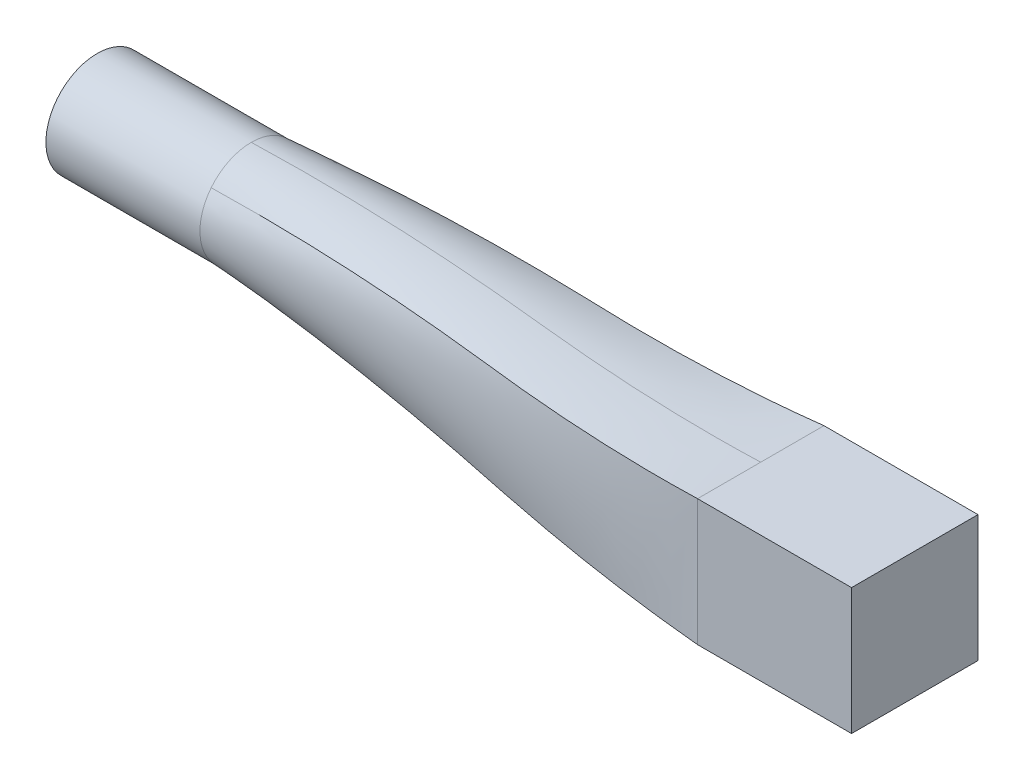
ISO-10303-21;
HEADER;
FILE_DESCRIPTION(('STEP AP214'),'2;1');
FILE_NAME('part.step','',(''),(''),'','','');
FILE_SCHEMA(('AUTOMOTIVE_DESIGN { 1 0 10303 214 1 1 1 1 }'));
ENDSEC;
DATA;
#1=APPLICATION_CONTEXT('core data for automotive mechanical design processes');
#2=APPLICATION_PROTOCOL_DEFINITION('international standard','automotive_design',2000,#1);
#3=PRODUCT_CONTEXT('',#1,'mechanical');
#4=PRODUCT('Part','Part','',(#3));
#5=PRODUCT_RELATED_PRODUCT_CATEGORY('part','',(#4));
#6=PRODUCT_DEFINITION_FORMATION('','',#4);
#7=PRODUCT_DEFINITION_CONTEXT('part definition',#1,'design');
#8=PRODUCT_DEFINITION('design','',#6,#7);
#9=PRODUCT_DEFINITION_SHAPE('','',#8);
#10=(LENGTH_UNIT() NAMED_UNIT(*) SI_UNIT(.MILLI.,.METRE.));
#11=(NAMED_UNIT(*) PLANE_ANGLE_UNIT() SI_UNIT($,.RADIAN.));
#12=(NAMED_UNIT(*) SI_UNIT($,.STERADIAN.) SOLID_ANGLE_UNIT());
#13=UNCERTAINTY_MEASURE_WITH_UNIT(LENGTH_MEASURE(1.E-05),#10,'distance_accuracy_value','');
#14=(GEOMETRIC_REPRESENTATION_CONTEXT(3) GLOBAL_UNCERTAINTY_ASSIGNED_CONTEXT((#13)) GLOBAL_UNIT_ASSIGNED_CONTEXT((#10,
#11,#12)) REPRESENTATION_CONTEXT('',''));
#15=CARTESIAN_POINT('',(0.,0.,0.));
#16=DIRECTION('',(0.,0.,1.));
#17=DIRECTION('',(1.,0.,0.));
#18=AXIS2_PLACEMENT_3D('',#15,#16,#17);
#19=CARTESIAN_POINT('',(0.,63.7863619156872,-79.7329523946089));
#20=CARTESIAN_POINT('',(193.877836208573,77.1217264968186,-88.5158134764794));
#21=CARTESIAN_POINT('',(387.852255577892,75.7807951885969,-97.2986745583499));
#22=CARTESIAN_POINT('',(724.025214907135,47.9362334339431,-112.631023760147));
#23=CARTESIAN_POINT('',(868.712821410133,47.2684985361766,-119.180511880073));
#24=CARTESIAN_POINT('',(1013.26771114708,57.8788888677979,-125.73));
#25=CARTESIAN_POINT('',(0.,69.4779385507464,-75.1796910865616));
#26=CARTESIAN_POINT('',(193.877836208573,81.7265306209246,-82.7308405347025));
#27=CARTESIAN_POINT('',(387.852255577892,79.2988268017497,-90.2819899828435));
#28=CARTESIAN_POINT('',(724.025214907135,49.5570728354095,-103.464124953968));
#29=CARTESIAN_POINT('',(868.712821410133,48.0789182369098,-109.095110476952));
#30=CARTESIAN_POINT('',(1013.26771114708,57.8788888677979,-114.726095999935));
#31=CARTESIAN_POINT('',(0.,80.1263231421359,-64.6489366794776));
#32=CARTESIAN_POINT('',(193.877836208573,90.3416698741602,-70.117757743955));
#33=CARTESIAN_POINT('',(387.852255577892,85.8807207168314,-75.5865788084324));
#34=CARTESIAN_POINT('',(724.025214907135,52.5895052200281,-85.1335673695738));
#35=CARTESIAN_POINT('',(868.712821410133,49.5951344292191,-89.2117348662377));
#36=CARTESIAN_POINT('',(1013.26771114708,57.8788888677979,-93.2899023629016));
#37=CARTESIAN_POINT('',(0.,90.4960369406616,-48.3933185319076));
#38=CARTESIAN_POINT('',(193.877836208573,98.7313488553962,-51.9974731378035));
#39=CARTESIAN_POINT('',(387.852255577892,92.2903648807777,-55.6016277436994));
#40=CARTESIAN_POINT('',(724.025214907135,55.5425781177991,-61.893445009138));
#41=CARTESIAN_POINT('',(868.712821410133,51.0716708781046,-64.5811076686806));
#42=CARTESIAN_POINT('',(1013.26771114708,57.8788888677979,-67.2687703282233));
#43=CARTESIAN_POINT('',(0.,96.4786554645607,-34.098932619656));
#44=CARTESIAN_POINT('',(193.877836208573,103.571622160706,-36.4906606033748));
#45=CARTESIAN_POINT('',(387.852255577892,95.9882929674987,-38.8823885870935));
#46=CARTESIAN_POINT('',(724.025214907135,57.2463000298871,-43.0576577050101));
#47=CARTESIAN_POINT('',(868.712821410133,51.9235318341486,-44.841198839208));
#48=CARTESIAN_POINT('',(1013.26771114708,57.8788888677979,-46.6247399734059));
#49=CARTESIAN_POINT('',(0.,99.7287540430286,-22.9225454122928));
#50=CARTESIAN_POINT('',(193.877836208573,106.201133857991,-24.4958663298067));
#51=CARTESIAN_POINT('',(387.852255577892,97.9972177836001,-26.0691872473206));
#52=CARTESIAN_POINT('',(724.025214907135,58.1718586531658,-28.815753029126));
#53=CARTESIAN_POINT('',(868.712821410133,52.3863111457879,-29.9889978934174));
#54=CARTESIAN_POINT('',(1013.26771114708,57.8788888677979,-31.1622427577088));
#55=CARTESIAN_POINT('',(0.,101.679670600911,-11.4807903492074));
#56=CARTESIAN_POINT('',(193.877836208573,107.7795345697,-12.2777083176404));
#57=CARTESIAN_POINT('',(387.852255577892,99.2031026491359,-13.0746262860734));
#58=CARTESIAN_POINT('',(724.025214907135,58.7274379994073,-14.4658158384646));
#59=CARTESIAN_POINT('',(868.712821410133,52.6641008189087,-15.0600874224228));
#60=CARTESIAN_POINT('',(1013.26771114708,57.8788888677979,-15.6543590063811));
#61=CARTESIAN_POINT('',(0.,102.108,-3.81226759974524));
#62=CARTESIAN_POINT('',(193.877836208573,108.126077032337,-4.08464588073089));
#63=CARTESIAN_POINT('',(387.852255577892,99.4678581753207,-4.35702416171652));
#64=CARTESIAN_POINT('',(724.025214907135,58.8494170592293,-4.83251829513478));
#65=CARTESIAN_POINT('',(868.712821410133,52.7250903488197,-5.0356341475674));
#66=CARTESIAN_POINT('',(1013.26771114708,57.8788888677979,-5.23875000000002));
#67=CARTESIAN_POINT('',(0.,102.108,0.));
#68=CARTESIAN_POINT('',(193.877836208573,108.126077032337,0.));
#69=CARTESIAN_POINT('',(387.852255577892,99.4678581753207,0.));
#70=CARTESIAN_POINT('',(724.025214907135,58.8494170592293,0.));
#71=CARTESIAN_POINT('',(868.712821410133,52.7250903488197,0.));
#72=CARTESIAN_POINT('',(1013.26771114708,57.8788888677979,0.));
#73=B_SPLINE_SURFACE_WITH_KNOTS('',3,3,((#19,#20,#21,#22,#23,#24),(#25,#26,#27,#28,#29,#30),
(#31,#32,#33,#34,#35,#36),(#37,#38,#39,#40,#41,#42),(#43,#44,#45,#46,#47,#48),(#49,#50,#51,#52,
#53,#54),(#55,#56,#57,#58,#59,#60),(#61,#62,#63,#64,#65,#66),(#67,#68,#69,#70,#71,#72)),
.UNSPECIFIED.,.F.,.F.,.F.,(4,1,1,1,1,1,4),(4,2,4),(0.866194178130681,0.899645633598011,
0.93309708906534,0.949822816799005,0.96654854453267,0.983274272266335,1.),(0.,0.572832053736493,
1.),.UNSPECIFIED.);
#74=CARTESIAN_POINT('',(0.,0.,0.));
#75=DIRECTION('',(1.,0.,0.));
#76=DIRECTION('',(0.,0.,-1.));
#77=AXIS2_PLACEMENT_3D('',#74,#75,#76);
#78=CIRCLE('',#77,102.108);
#79=CARTESIAN_POINT('',(0.,63.7867207358618,-79.7334010755966));
#80=VERTEX_POINT('',#79);
#81=CARTESIAN_POINT('',(0.,102.108,0.));
#82=VERTEX_POINT('',#81);
#83=EDGE_CURVE('E297',#80,#82,#78,.T.);
#84=CARTESIAN_POINT('',(0.,102.108,0.));
#85=CARTESIAN_POINT('',(193.877836208573,108.126077032337,0.));
#86=CARTESIAN_POINT('',(387.852255577892,99.4678581753207,0.));
#87=CARTESIAN_POINT('',(724.025214907135,58.8494170592293,0.));
#88=CARTESIAN_POINT('',(868.712821410133,52.7250903488197,0.));
#89=CARTESIAN_POINT('',(1013.26771114708,57.8788888677979,0.));
#90=B_SPLINE_CURVE_WITH_KNOTS('',3,(#84,#85,#86,#87,#88,#89),.UNSPECIFIED.,.F.,.F.,(4,2,4),(0.,
0.572832053736493,1.),.UNSPECIFIED.);
#91=CARTESIAN_POINT('',(1013.26771114708,57.8788888677979,0.));
#92=VERTEX_POINT('',#91);
#93=EDGE_CURVE('E366',#82,#92,#90,.T.);
#94=DIRECTION('',(0.,0.,1.));
#95=VECTOR('',#94,1.);
#96=CARTESIAN_POINT('',(1013.26771114708,57.8788888677978,125.73));
#97=LINE('',#96,#95);
#98=CARTESIAN_POINT('',(1013.26771114708,57.8788888677979,-125.73));
#99=VERTEX_POINT('',#98);
#100=EDGE_CURVE('E229',#99,#92,#97,.T.);
#101=CARTESIAN_POINT('',(0.,63.7863619156872,-79.7329523946089));
#102=CARTESIAN_POINT('',(193.877836208573,77.1217264968186,-88.5158134764794));
#103=CARTESIAN_POINT('',(387.852255577892,75.7807951885969,-97.2986745583499));
#104=CARTESIAN_POINT('',(724.025214907135,47.9362334339431,-112.631023760147));
#105=CARTESIAN_POINT('',(868.712821410133,47.2684985361766,-119.180511880073));
#106=CARTESIAN_POINT('',(1013.26771114708,57.8788888677979,-125.73));
#107=B_SPLINE_CURVE_WITH_KNOTS('',3,(#101,#102,#103,#104,#105,#106),.UNSPECIFIED.,.F.,.F.,(4,2,
4),(0.,0.572832053736493,1.),.UNSPECIFIED.);
#108=EDGE_CURVE('E365',#80,#99,#107,.T.);
#109=ORIENTED_EDGE('',*,*,#83,.T.);
#110=ORIENTED_EDGE('',*,*,#93,.T.);
#111=ORIENTED_EDGE('',*,*,#100,.F.);
#112=ORIENTED_EDGE('',*,*,#108,.F.);
#113=EDGE_LOOP('',(#109,#110,#111,#112));
#114=FACE_BOUND('',#113,.T.);
#115=ADVANCED_FACE('F127',(#114),#73,.T.);
#116=CARTESIAN_POINT('',(0.,-78.4415384171288,-65.3679486809407));
#117=CARTESIAN_POINT('',(193.877836208573,-85.9633898314315,-76.8937212892222));
#118=CARTESIAN_POINT('',(387.852255577892,-108.161537135087,-88.4194938975037));
#119=CARTESIAN_POINT('',(724.025214907135,-172.416798778802,-108.540177670523));
#120=CARTESIAN_POINT('',(868.712821410133,-188.638017570196,-117.135088835262));
#121=CARTESIAN_POINT('',(1013.26771114708,-193.581111132202,-125.73));
#122=CARTESIAN_POINT('',(0.,-74.2176822369396,-70.4365760971678));
#123=CARTESIAN_POINT('',(193.877836208573,-80.5454377736961,-80.9945246212951));
#124=CARTESIAN_POINT('',(387.852255577892,-101.549489199806,-91.5524731454224));
#125=CARTESIAN_POINT('',(724.025214907135,-163.720202903584,-109.983614446367));
#126=CARTESIAN_POINT('',(868.712821410133,-179.050969632587,-117.856807223183));
#127=CARTESIAN_POINT('',(1013.26771114708,-183.103611132202,-125.73));
#128=CARTESIAN_POINT('',(0.,-64.7847113542134,-79.7525874017347));
#129=CARTESIAN_POINT('',(193.877836208573,-68.9124043568166,-88.5316992964529));
#130=CARTESIAN_POINT('',(387.852255577892,-87.716393248773,-97.310811191171));
#131=CARTESIAN_POINT('',(724.025214907135,-146.046430580127,-112.636615390593));
#132=CARTESIAN_POINT('',(868.712821410133,-159.736583470858,-119.183307695296));
#133=CARTESIAN_POINT('',(1013.26771114708,-162.148611132202,-125.73));
#134=CARTESIAN_POINT('',(0.,-48.2077073794318,-90.7386603327388));
#135=CARTESIAN_POINT('',(193.877836208573,-49.4988322829016,-97.420047320935));
#136=CARTESIAN_POINT('',(387.852255577892,-65.4662530757246,-104.101434309131));
#137=CARTESIAN_POINT('',(724.025214907135,-118.844458398672,-115.765214198218));
#138=CARTESIAN_POINT('',(868.712821410133,-130.419347380131,-120.747607099109));
#139=CARTESIAN_POINT('',(1013.26771114708,-130.716111132202,-125.73));
#140=CARTESIAN_POINT('',(0.,-29.82513639635,-98.3258417527661));
#141=CARTESIAN_POINT('',(193.877836208573,-28.6244554198609,-103.558501835994));
#142=CARTESIAN_POINT('',(387.852255577892,-42.100070332725,-108.791161919221));
#143=CARTESIAN_POINT('',(724.025214907135,-91.1282993166997,-117.925881334966));
#144=CARTESIAN_POINT('',(868.712821410133,-100.845017839145,-121.827940667483));
#145=CARTESIAN_POINT('',(1013.26771114708,-99.2836111322021,-125.73));
#146=CARTESIAN_POINT('',(0.,-10.3251775795024,-102.229582182344));
#147=CARTESIAN_POINT('',(193.877836208573,-6.84604924559982,-106.716846383061));
#148=CARTESIAN_POINT('',(387.852255577892,-18.0432168010504,-111.204110583779));
#149=CARTESIAN_POINT('',(724.025214907135,-63.0939320573077,-119.037583189665));
#150=CARTESIAN_POINT('',(868.712821410133,-71.1115842094488,-122.383791594832));
#151=CARTESIAN_POINT('',(1013.26771114708,-67.8511111322021,-125.73));
#152=CARTESIAN_POINT('',(0.,9.56155319842292,-102.303893463957));
#153=CARTESIAN_POINT('',(193.877836208573,15.245277097475,-106.776968369987));
#154=CARTESIAN_POINT('',(387.852255577892,6.25270510717395,-111.250043276018));
#155=CARTESIAN_POINT('',(724.025214907135,-34.9494204083917,-119.058745454699));
#156=CARTESIAN_POINT('',(868.712821410133,-41.3230783849908,-122.394372727349));
#157=CARTESIAN_POINT('',(1013.26771114708,-36.4186111322021,-125.73));
#158=CARTESIAN_POINT('',(0.,29.0900037462302,-98.5457214282047));
#159=CARTESIAN_POINT('',(193.877836208573,37.0467346771091,-103.736396802747));
#160=CARTESIAN_POINT('',(387.852255577892,30.3271697186348,-108.927072177289));
#161=CARTESIAN_POINT('',(724.025214907135,-6.9069393128666,-117.988498367887));
#162=CARTESIAN_POINT('',(868.712821410133,-11.5855878372283,-121.859249183944));
#163=CARTESIAN_POINT('',(1013.26771114708,-4.98611113220207,-125.73));
#164=CARTESIAN_POINT('',(0.,47.5289947982123,-91.096260494005));
#165=CARTESIAN_POINT('',(193.877836208573,57.9667585344034,-97.709365870603));
#166=CARTESIAN_POINT('',(387.852255577892,53.7282263812413,-104.322471247201));
#167=CARTESIAN_POINT('',(724.025214907135,20.8252869990792,-115.867051082533));
#168=CARTESIAN_POINT('',(868.712821410133,17.9967753187446,-120.798525541266));
#169=CARTESIAN_POINT('',(1013.26771114708,26.4463888677979,-125.73));
#170=CARTESIAN_POINT('',(0.,58.634287687681,-83.8546117770138));
#171=CARTESIAN_POINT('',(193.877836208573,70.952794074815,-91.8504666559426));
#172=CARTESIAN_POINT('',(387.852255577892,68.5950045725957,-99.8463215348713));
#173=CARTESIAN_POINT('',(724.025214907135,38.975300893944,-113.804784275867));
#174=CARTESIAN_POINT('',(868.712821410133,37.549282266177,-119.767392137933));
#175=CARTESIAN_POINT('',(1013.26771114708,47.4013888677979,-125.73));
#176=CARTESIAN_POINT('',(0.,63.7863619156872,-79.7329523946089));
#177=CARTESIAN_POINT('',(193.877836208573,77.1217264968186,-88.5158134764794));
#178=CARTESIAN_POINT('',(387.852255577892,75.7807951885969,-97.2986745583499));
#179=CARTESIAN_POINT('',(724.025214907135,47.9362334339431,-112.631023760147));
#180=CARTESIAN_POINT('',(868.712821410133,47.2684985361766,-119.180511880073));
#181=CARTESIAN_POINT('',(1013.26771114708,57.8788888677979,-125.73));
#182=B_SPLINE_SURFACE_WITH_KNOTS('',3,3,((#116,#117,#118,#119,#120,#121),(#122,#123,#124,#125,
#126,#127),(#128,#129,#130,#131,#132,#133),(#134,#135,#136,#137,#138,#139),(#140,#141,#142,#143,
#144,#145),(#146,#147,#148,#149,#150,#151),(#152,#153,#154,#155,#156,#157),(#158,#159,#160,#161,
#162,#163),(#164,#165,#166,#167,#168,#169),(#170,#171,#172,#173,#174,#175),(#176,#177,#178,#179,
#180,#181)),.UNSPECIFIED.,.F.,.F.,.F.,(4,1,1,1,1,1,1,1,4),(4,2,4),(0.617785515405924,
0.648836598246519,0.679887681087113,0.710938763927708,0.741989846768302,0.773040929608897,
0.804092012449491,0.835143095290086,0.866194178130681),(0.,0.572832053736493,1.),.UNSPECIFIED.);
#183=CARTESIAN_POINT('',(0.,-78.4419888320103,-65.3683241179851));
#184=VERTEX_POINT('',#183);
#185=EDGE_CURVE('E223',#184,#80,#78,.T.);
#186=DIRECTION('',(0.,1.,0.));
#187=VECTOR('',#186,1.);
#188=CARTESIAN_POINT('',(1013.26771114708,-193.581111132202,-125.73));
#189=LINE('',#188,#187);
#190=CARTESIAN_POINT('',(1013.26771114708,-193.581111132202,-125.73));
#191=VERTEX_POINT('',#190);
#192=EDGE_CURVE('E133',#191,#99,#189,.T.);
#193=CARTESIAN_POINT('',(0.,-78.4415384171288,-65.3679486809407));
#194=CARTESIAN_POINT('',(193.877836208573,-85.9633898314315,-76.8937212892222));
#195=CARTESIAN_POINT('',(387.852255577892,-108.161537135087,-88.4194938975037));
#196=CARTESIAN_POINT('',(724.025214907135,-172.416798778802,-108.540177670523));
#197=CARTESIAN_POINT('',(868.712821410133,-188.638017570196,-117.135088835262));
#198=CARTESIAN_POINT('',(1013.26771114708,-193.581111132202,-125.73));
#199=B_SPLINE_CURVE_WITH_KNOTS('',3,(#193,#194,#195,#196,#197,#198),.UNSPECIFIED.,.F.,.F.,(4,2,
4),(0.,0.572832053736493,1.),.UNSPECIFIED.);
#200=EDGE_CURVE('E431',#184,#191,#199,.T.);
#201=ORIENTED_EDGE('',*,*,#185,.T.);
#202=ORIENTED_EDGE('',*,*,#108,.T.);
#203=ORIENTED_EDGE('',*,*,#192,.F.);
#204=ORIENTED_EDGE('',*,*,#200,.F.);
#205=EDGE_LOOP('',(#201,#202,#203,#204));
#206=FACE_BOUND('',#205,.T.);
#207=ADVANCED_FACE('F430',(#206),#182,.T.);
#208=CARTESIAN_POINT('',(0.,-78.4415384171289,65.3679486809407));
#209=CARTESIAN_POINT('',(193.877836208573,-85.9633898314316,76.8937212892221));
#210=CARTESIAN_POINT('',(387.852255577892,-108.161537135087,88.4194938975036));
#211=CARTESIAN_POINT('',(724.025214907135,-172.416798778803,108.540177670523));
#212=CARTESIAN_POINT('',(868.712821410133,-188.638017570196,117.135088835262));
#213=CARTESIAN_POINT('',(1013.26771114708,-193.581111132202,125.73));
#214=CARTESIAN_POINT('',(0.,-82.2260063866525,60.8265871175123));
#215=CARTESIAN_POINT('',(193.877836208573,-89.0252362811945,71.2188896018319));
#216=CARTESIAN_POINT('',(387.852255577892,-110.50076206509,81.6111920861515));
#217=CARTESIAN_POINT('',(724.025214907135,-173.49453438563,99.7531630469807));
#218=CARTESIAN_POINT('',(868.712821410133,-189.17688537361,107.50283152349));
#219=CARTESIAN_POINT('',(1013.26771114708,-193.581111132202,115.2525));
#220=CARTESIAN_POINT('',(0.,-89.0043177012511,51.085121977123));
#221=CARTESIAN_POINT('',(193.877836208573,-94.5092695987241,59.3362670603504));
#222=CARTESIAN_POINT('',(387.852255577892,-114.69051738555,67.5874121435779));
#223=CARTESIAN_POINT('',(724.025214907134,-175.424852601225,81.9915381512036));
#224=CARTESIAN_POINT('',(868.712821410133,-190.142044481407,88.1445190756017));
#225=CARTESIAN_POINT('',(1013.26771114708,-193.581111132202,94.2975));
#226=CARTESIAN_POINT('',(0.,-96.4932572646997,34.9353565808207));
#227=CARTESIAN_POINT('',(193.877836208573,-100.568240952026,40.2683549141328));
#228=CARTESIAN_POINT('',(387.852255577892,-119.319520528706,45.601353247445));
#229=CARTESIAN_POINT('',(724.025214907134,-177.557542556565,54.9112343871714));
#230=CARTESIAN_POINT('',(868.712821410133,-191.208389459077,58.8881171935857));
#231=CARTESIAN_POINT('',(1013.26771114708,-193.581111132202,62.865));
#232=CARTESIAN_POINT('',(0.,-101.078827103032,17.7345338404043));
#233=CARTESIAN_POINT('',(193.877836208573,-104.278223661011,20.3500785361424));
#234=CARTESIAN_POINT('',(387.852255577892,-122.153916108343,22.9656232318804));
#235=CARTESIAN_POINT('',(724.025214907135,-178.863414856757,27.5316119517457));
#236=CARTESIAN_POINT('',(868.712821410133,-191.861325609173,29.4820559758728));
#237=CARTESIAN_POINT('',(1013.26771114708,-193.581111132202,31.4325));
#238=CARTESIAN_POINT('',(0.,-102.62277363291,0.));
#239=CARTESIAN_POINT('',(193.877836208573,-105.527362837033,0.));
#240=CARTESIAN_POINT('',(387.852255577892,-123.108247930508,0.));
#241=CARTESIAN_POINT('',(724.025214907135,-179.303097835629,0.));
#242=CARTESIAN_POINT('',(868.712821410133,-192.08116709861,0.));
#243=CARTESIAN_POINT('',(1013.26771114708,-193.581111132202,0.));
#244=CARTESIAN_POINT('',(0.,-101.078827103032,-17.7345338404043));
#245=CARTESIAN_POINT('',(193.877836208573,-104.278223661011,-20.3500785361424));
#246=CARTESIAN_POINT('',(387.852255577892,-122.153916108343,-22.9656232318804));
#247=CARTESIAN_POINT('',(724.025214907135,-178.863414856757,-27.5316119517457));
#248=CARTESIAN_POINT('',(868.712821410133,-191.861325609173,-29.4820559758728));
#249=CARTESIAN_POINT('',(1013.26771114708,-193.581111132202,-31.4325));
#250=CARTESIAN_POINT('',(0.,-96.4932572646994,-34.9353565808208));
#251=CARTESIAN_POINT('',(193.877836208573,-100.568240952026,-40.268354914133));
#252=CARTESIAN_POINT('',(387.852255577892,-119.319520528706,-45.6013532474451));
#253=CARTESIAN_POINT('',(724.025214907135,-177.557542556564,-54.9112343871715));
#254=CARTESIAN_POINT('',(868.712821410133,-191.208389459077,-58.8881171935858));
#255=CARTESIAN_POINT('',(1013.26771114708,-193.581111132202,-62.865));
#256=CARTESIAN_POINT('',(0.,-89.0043177012514,-51.0851219771229));
#257=CARTESIAN_POINT('',(193.877836208573,-94.5092695987243,-59.3362670603504));
#258=CARTESIAN_POINT('',(387.852255577892,-114.69051738555,-67.5874121435779));
#259=CARTESIAN_POINT('',(724.025214907134,-175.424852601225,-81.9915381512036));
#260=CARTESIAN_POINT('',(868.712821410133,-190.142044481407,-88.1445190756018));
#261=CARTESIAN_POINT('',(1013.26771114708,-193.581111132202,-94.2975));
#262=CARTESIAN_POINT('',(0.,-82.2260063866525,-60.8265871175123));
#263=CARTESIAN_POINT('',(193.877836208573,-89.0252362811945,-71.218889601832));
#264=CARTESIAN_POINT('',(387.852255577892,-110.50076206509,-81.6111920861516));
#265=CARTESIAN_POINT('',(724.025214907135,-173.49453438563,-99.7531630469808));
#266=CARTESIAN_POINT('',(868.712821410133,-189.17688537361,-107.50283152349));
#267=CARTESIAN_POINT('',(1013.26771114708,-193.581111132202,-115.2525));
#268=CARTESIAN_POINT('',(0.,-78.4415384171288,-65.3679486809407));
#269=CARTESIAN_POINT('',(193.877836208573,-85.9633898314315,-76.8937212892222));
#270=CARTESIAN_POINT('',(387.852255577892,-108.161537135087,-88.4194938975037));
#271=CARTESIAN_POINT('',(724.025214907135,-172.416798778802,-108.540177670523));
#272=CARTESIAN_POINT('',(868.712821410133,-188.638017570196,-117.135088835262));
#273=CARTESIAN_POINT('',(1013.26771114708,-193.581111132202,-125.73));
#274=B_SPLINE_SURFACE_WITH_KNOTS('',3,3,((#208,#209,#210,#211,#212,#213),(#214,#215,#216,#217,
#218,#219),(#220,#221,#222,#223,#224,#225),(#226,#227,#228,#229,#230,#231),(#232,#233,#234,#235,
#236,#237),(#238,#239,#240,#241,#242,#243),(#244,#245,#246,#247,#248,#249),(#250,#251,#252,#253,
#254,#255),(#256,#257,#258,#259,#260,#261),(#262,#263,#264,#265,#266,#267),(#268,#269,#270,#271,
#272,#273)),.UNSPECIFIED.,.F.,.F.,.F.,(4,1,1,1,1,1,1,1,4),(4,2,4),(0.382214484594076,
0.411660863445557,0.441107242297038,0.470553621148519,0.5,0.529446378851481,0.558892757702962,
0.588339136554443,0.617785515405924),(0.,0.572832053736493,1.),.UNSPECIFIED.);
#275=CARTESIAN_POINT('',(0.,-78.4419910130432,65.3683259191914));
#276=VERTEX_POINT('',#275);
#277=EDGE_CURVE('E280',#276,#184,#78,.T.);
#278=DIRECTION('',(0.,0.,-1.));
#279=VECTOR('',#278,1.);
#280=CARTESIAN_POINT('',(1013.26771114708,-193.581111132202,125.73));
#281=LINE('',#280,#279);
#282=CARTESIAN_POINT('',(1013.26771114708,-193.581111132202,125.73));
#283=VERTEX_POINT('',#282);
#284=EDGE_CURVE('E13',#283,#191,#281,.T.);
#285=CARTESIAN_POINT('',(0.,-78.4415384171289,65.3679486809407));
#286=CARTESIAN_POINT('',(193.877836208573,-85.9633898314316,76.8937212892221));
#287=CARTESIAN_POINT('',(387.852255577892,-108.161537135087,88.4194938975036));
#288=CARTESIAN_POINT('',(724.025214907135,-172.416798778803,108.540177670523));
#289=CARTESIAN_POINT('',(868.712821410133,-188.638017570196,117.135088835262));
#290=CARTESIAN_POINT('',(1013.26771114708,-193.581111132202,125.73));
#291=B_SPLINE_CURVE_WITH_KNOTS('',3,(#285,#286,#287,#288,#289,#290),.UNSPECIFIED.,.F.,.F.,(4,2,
4),(0.,0.572832053736493,1.),.UNSPECIFIED.);
#292=EDGE_CURVE('E156',#276,#283,#291,.T.);
#293=ORIENTED_EDGE('',*,*,#277,.T.);
#294=ORIENTED_EDGE('',*,*,#200,.T.);
#295=ORIENTED_EDGE('',*,*,#284,.F.);
#296=ORIENTED_EDGE('',*,*,#292,.F.);
#297=EDGE_LOOP('',(#293,#294,#295,#296));
#298=FACE_BOUND('',#297,.T.);
#299=ADVANCED_FACE('F398',(#298),#274,.T.);
#300=CARTESIAN_POINT('',(0.,63.7863619156871,79.7329523946089));
#301=CARTESIAN_POINT('',(193.877836208573,77.1217264968185,88.5158134764794));
#302=CARTESIAN_POINT('',(387.852255577892,75.7807951885968,97.2986745583499));
#303=CARTESIAN_POINT('',(724.025214907135,47.9362334339431,112.631023760147));
#304=CARTESIAN_POINT('',(868.712821410133,47.2684985361765,119.180511880073));
#305=CARTESIAN_POINT('',(1013.26771114708,57.8788888677978,125.73));
#306=CARTESIAN_POINT('',(0.,58.634287687681,83.8546117770138));
#307=CARTESIAN_POINT('',(193.877836208573,70.9527940748149,91.8504666559425));
#308=CARTESIAN_POINT('',(387.852255577892,68.5950045725957,99.8463215348713));
#309=CARTESIAN_POINT('',(724.025214907135,38.975300893944,113.804784275867));
#310=CARTESIAN_POINT('',(868.712821410133,37.549282266177,119.767392137933));
#311=CARTESIAN_POINT('',(1013.26771114708,47.4013888677978,125.73));
#312=CARTESIAN_POINT('',(0.,47.5289947982123,91.096260494005));
#313=CARTESIAN_POINT('',(193.877836208573,57.9667585344033,97.7093658706029));
#314=CARTESIAN_POINT('',(387.852255577892,53.7282263812412,104.322471247201));
#315=CARTESIAN_POINT('',(724.025214907135,20.8252869990791,115.867051082533));
#316=CARTESIAN_POINT('',(868.712821410133,17.9967753187445,120.798525541266));
#317=CARTESIAN_POINT('',(1013.26771114708,26.4463888677978,125.73));
#318=CARTESIAN_POINT('',(0.,29.09000374623,98.5457214282047));
#319=CARTESIAN_POINT('',(193.877836208573,37.0467346771089,103.736396802747));
#320=CARTESIAN_POINT('',(387.852255577892,30.3271697186346,108.927072177289));
#321=CARTESIAN_POINT('',(724.025214907135,-6.90693931286677,117.988498367888));
#322=CARTESIAN_POINT('',(868.712821410133,-11.5855878372284,121.859249183944));
#323=CARTESIAN_POINT('',(1013.26771114708,-4.98611113220222,125.73));
#324=CARTESIAN_POINT('',(0.,9.56155319842293,102.303893463957));
#325=CARTESIAN_POINT('',(193.877836208573,15.245277097475,106.776968369987));
#326=CARTESIAN_POINT('',(387.852255577892,6.25270510717395,111.250043276018));
#327=CARTESIAN_POINT('',(724.025214907135,-34.9494204083917,119.058745454699));
#328=CARTESIAN_POINT('',(868.712821410133,-41.3230783849908,122.394372727349));
#329=CARTESIAN_POINT('',(1013.26771114708,-36.4186111322021,125.73));
#330=CARTESIAN_POINT('',(0.,-10.3251775795026,102.229582182343));
#331=CARTESIAN_POINT('',(193.877836208573,-6.84604924560002,106.716846383061));
#332=CARTESIAN_POINT('',(387.852255577892,-18.0432168010506,111.204110583779));
#333=CARTESIAN_POINT('',(724.025214907134,-63.0939320573077,119.037583189665));
#334=CARTESIAN_POINT('',(868.712821410133,-71.1115842094488,122.383791594832));
#335=CARTESIAN_POINT('',(1013.26771114708,-67.851111132202,125.73));
#336=CARTESIAN_POINT('',(0.,-29.8251363963498,98.3258417527662));
#337=CARTESIAN_POINT('',(193.877836208573,-28.6244554198608,103.558501835994));
#338=CARTESIAN_POINT('',(387.852255577892,-42.1000703327249,108.791161919221));
#339=CARTESIAN_POINT('',(724.025214907135,-91.1282993166997,117.925881334966));
#340=CARTESIAN_POINT('',(868.712821410133,-100.845017839145,121.827940667483));
#341=CARTESIAN_POINT('',(1013.26771114708,-99.2836111322021,125.73));
#342=CARTESIAN_POINT('',(0.,-48.207707379432,90.7386603327385));
#343=CARTESIAN_POINT('',(193.877836208573,-49.4988322829018,97.4200473209347));
#344=CARTESIAN_POINT('',(387.852255577892,-65.4662530757248,104.101434309131));
#345=CARTESIAN_POINT('',(724.025214907135,-118.844458398672,115.765214198218));
#346=CARTESIAN_POINT('',(868.712821410133,-130.419347380131,120.747607099109));
#347=CARTESIAN_POINT('',(1013.26771114708,-130.716111132202,125.73));
#348=CARTESIAN_POINT('',(0.,-64.7847113542131,79.7525874017348));
#349=CARTESIAN_POINT('',(193.877836208573,-68.9124043568165,88.5316992964529));
#350=CARTESIAN_POINT('',(387.852255577892,-87.7163932487729,97.310811191171));
#351=CARTESIAN_POINT('',(724.025214907135,-146.046430580127,112.636615390593));
#352=CARTESIAN_POINT('',(868.712821410133,-159.736583470858,119.183307695296));
#353=CARTESIAN_POINT('',(1013.26771114708,-162.148611132202,125.73));
#354=CARTESIAN_POINT('',(0.,-74.2176822369396,70.4365760971678));
#355=CARTESIAN_POINT('',(193.877836208573,-80.5454377736961,80.994524621295));
#356=CARTESIAN_POINT('',(387.852255577892,-101.549489199806,91.5524731454223));
#357=CARTESIAN_POINT('',(724.025214907135,-163.720202903584,109.983614446366));
#358=CARTESIAN_POINT('',(868.712821410133,-179.050969632587,117.856807223183));
#359=CARTESIAN_POINT('',(1013.26771114708,-183.103611132202,125.73));
#360=CARTESIAN_POINT('',(0.,-78.4415384171289,65.3679486809407));
#361=CARTESIAN_POINT('',(193.877836208573,-85.9633898314316,76.8937212892221));
#362=CARTESIAN_POINT('',(387.852255577892,-108.161537135087,88.4194938975036));
#363=CARTESIAN_POINT('',(724.025214907135,-172.416798778803,108.540177670523));
#364=CARTESIAN_POINT('',(868.712821410133,-188.638017570196,117.135088835262));
#365=CARTESIAN_POINT('',(1013.26771114708,-193.581111132202,125.73));
#366=B_SPLINE_SURFACE_WITH_KNOTS('',3,3,((#300,#301,#302,#303,#304,#305),(#306,#307,#308,#309,
#310,#311),(#312,#313,#314,#315,#316,#317),(#318,#319,#320,#321,#322,#323),(#324,#325,#326,#327,
#328,#329),(#330,#331,#332,#333,#334,#335),(#336,#337,#338,#339,#340,#341),(#342,#343,#344,#345,
#346,#347),(#348,#349,#350,#351,#352,#353),(#354,#355,#356,#357,#358,#359),(#360,#361,#362,#363,
#364,#365)),.UNSPECIFIED.,.F.,.F.,.F.,(4,1,1,1,1,1,1,1,4),(4,2,4),(0.133805821869319,
0.164856904709914,0.195907987550509,0.226959070391103,0.258010153231698,0.289061236072292,
0.320112318912887,0.351163401753481,0.382214484594076),(0.,0.572832053736493,1.),.UNSPECIFIED.);
#367=CARTESIAN_POINT('',(0.,63.786719965018,79.7334001299471));
#368=VERTEX_POINT('',#367);
#369=EDGE_CURVE('E298',#368,#276,#78,.T.);
#370=DIRECTION('',(0.,-1.,0.));
#371=VECTOR('',#370,1.);
#372=CARTESIAN_POINT('',(1013.26771114708,57.8788888677978,125.73));
#373=LINE('',#372,#371);
#374=CARTESIAN_POINT('',(1013.26771114708,57.8788888677978,125.73));
#375=VERTEX_POINT('',#374);
#376=EDGE_CURVE('E139',#375,#283,#373,.T.);
#377=CARTESIAN_POINT('',(0.,63.7863619156871,79.7329523946089));
#378=CARTESIAN_POINT('',(193.877836208573,77.1217264968185,88.5158134764794));
#379=CARTESIAN_POINT('',(387.852255577892,75.7807951885968,97.2986745583499));
#380=CARTESIAN_POINT('',(724.025214907135,47.9362334339431,112.631023760147));
#381=CARTESIAN_POINT('',(868.712821410133,47.2684985361765,119.180511880073));
#382=CARTESIAN_POINT('',(1013.26771114708,57.8788888677978,125.73));
#383=B_SPLINE_CURVE_WITH_KNOTS('',3,(#377,#378,#379,#380,#381,#382),.UNSPECIFIED.,.F.,.F.,(4,2,
4),(0.,0.572832053736493,1.),.UNSPECIFIED.);
#384=EDGE_CURVE('E385',#368,#375,#383,.T.);
#385=ORIENTED_EDGE('',*,*,#369,.T.);
#386=ORIENTED_EDGE('',*,*,#292,.T.);
#387=ORIENTED_EDGE('',*,*,#376,.F.);
#388=ORIENTED_EDGE('',*,*,#384,.F.);
#389=EDGE_LOOP('',(#385,#386,#387,#388));
#390=FACE_BOUND('',#389,.T.);
#391=ADVANCED_FACE('F387',(#390),#366,.T.);
#392=CARTESIAN_POINT('',(0.,102.108,0.));
#393=CARTESIAN_POINT('',(193.877836208573,108.126077032337,0.));
#394=CARTESIAN_POINT('',(387.852255577892,99.4678581753207,0.));
#395=CARTESIAN_POINT('',(724.025214907135,58.8494170592293,0.));
#396=CARTESIAN_POINT('',(868.712821410133,52.7250903488197,0.));
#397=CARTESIAN_POINT('',(1013.26771114708,57.8788888677979,0.));
#398=CARTESIAN_POINT('',(0.,102.108,3.81226759974524));
#399=CARTESIAN_POINT('',(193.877836208573,108.126077032337,4.08464588073086));
#400=CARTESIAN_POINT('',(387.852255577892,99.4678581753207,4.35702416171649));
#401=CARTESIAN_POINT('',(724.025214907135,58.8494170592293,4.83251829513475));
#402=CARTESIAN_POINT('',(868.712821410133,52.7250903488197,5.03563414756738));
#403=CARTESIAN_POINT('',(1013.26771114708,57.8788888677979,5.23875));
#404=CARTESIAN_POINT('',(0.,101.679670600912,11.4807903492074));
#405=CARTESIAN_POINT('',(193.877836208573,107.7795345697,12.2777083176404));
#406=CARTESIAN_POINT('',(387.852255577892,99.203102649136,13.0746262860734));
#407=CARTESIAN_POINT('',(724.025214907134,58.7274379994074,14.4658158384646));
#408=CARTESIAN_POINT('',(868.712821410133,52.6641008189087,15.0600874224228));
#409=CARTESIAN_POINT('',(1013.26771114708,57.8788888677979,15.654359006381));
#410=CARTESIAN_POINT('',(0.,99.7287540430284,22.9225454122928));
#411=CARTESIAN_POINT('',(193.877836208573,106.201133857991,24.4958663298067));
#412=CARTESIAN_POINT('',(387.852255577892,97.9972177835999,26.0691872473206));
#413=CARTESIAN_POINT('',(724.025214907134,58.1718586531657,28.815753029126));
#414=CARTESIAN_POINT('',(868.712821410132,52.3863111457879,29.9889978934174));
#415=CARTESIAN_POINT('',(1013.26771114708,57.8788888677978,31.1622427577088));
#416=CARTESIAN_POINT('',(0.,96.4786554645609,34.098932619656));
#417=CARTESIAN_POINT('',(193.877836208573,103.571622160706,36.4906606033747));
#418=CARTESIAN_POINT('',(387.852255577892,95.9882929674988,38.8823885870934));
#419=CARTESIAN_POINT('',(724.025214907135,57.2463000298871,43.05765770501));
#420=CARTESIAN_POINT('',(868.712821410133,51.9235318341485,44.8411988392079));
#421=CARTESIAN_POINT('',(1013.26771114708,57.8788888677978,46.6247399734058));
#422=CARTESIAN_POINT('',(0.,90.4960369406615,48.3933185319076));
#423=CARTESIAN_POINT('',(193.877836208573,98.7313488553961,51.9974731378035));
#424=CARTESIAN_POINT('',(387.852255577892,92.2903648807776,55.6016277436994));
#425=CARTESIAN_POINT('',(724.025214907136,55.542578117799,61.8934450091379));
#426=CARTESIAN_POINT('',(868.712821410134,51.0716708781045,64.5811076686806));
#427=CARTESIAN_POINT('',(1013.26771114708,57.8788888677978,67.2687703282232));
#428=CARTESIAN_POINT('',(0.,80.1263231421358,64.6489366794775));
#429=CARTESIAN_POINT('',(193.877836208573,90.3416698741602,70.117757743955));
#430=CARTESIAN_POINT('',(387.852255577892,85.8807207168314,75.5865788084324));
#431=CARTESIAN_POINT('',(724.025214907134,52.5895052200281,85.1335673695738));
#432=CARTESIAN_POINT('',(868.712821410132,49.5951344292191,89.2117348662378));
#433=CARTESIAN_POINT('',(1013.26771114708,57.8788888677979,93.2899023629017));
#434=CARTESIAN_POINT('',(0.,69.4779385507464,75.1796910865616));
#435=CARTESIAN_POINT('',(193.877836208573,81.7265306209245,82.7308405347025));
#436=CARTESIAN_POINT('',(387.852255577892,79.2988268017496,90.2819899828435));
#437=CARTESIAN_POINT('',(724.025214907135,49.5570728354095,103.464124953968));
#438=CARTESIAN_POINT('',(868.712821410133,48.0789182369097,109.095110476952));
#439=CARTESIAN_POINT('',(1013.26771114708,57.8788888677978,114.726095999935));
#440=CARTESIAN_POINT('',(0.,63.7863619156871,79.7329523946089));
#441=CARTESIAN_POINT('',(193.877836208573,77.1217264968185,88.5158134764794));
#442=CARTESIAN_POINT('',(387.852255577892,75.7807951885968,97.2986745583499));
#443=CARTESIAN_POINT('',(724.025214907135,47.9362334339431,112.631023760147));
#444=CARTESIAN_POINT('',(868.712821410133,47.2684985361765,119.180511880073));
#445=CARTESIAN_POINT('',(1013.26771114708,57.8788888677978,125.73));
#446=B_SPLINE_SURFACE_WITH_KNOTS('',3,3,((#392,#393,#394,#395,#396,#397),(#398,#399,#400,#401,
#402,#403),(#404,#405,#406,#407,#408,#409),(#410,#411,#412,#413,#414,#415),(#416,#417,#418,#419,
#420,#421),(#422,#423,#424,#425,#426,#427),(#428,#429,#430,#431,#432,#433),(#434,#435,#436,#437,
#438,#439),(#440,#441,#442,#443,#444,#445)),.UNSPECIFIED.,.F.,.F.,.F.,(4,1,1,1,1,1,4),(4,2,4),
(0.,0.0167257277336649,0.0334514554673298,0.0501771832009947,0.0669029109346597,
0.100354366401989,0.133805821869319),(0.,0.572832053736493,1.),.UNSPECIFIED.);
#447=EDGE_CURVE('E296',#82,#368,#78,.T.);
#448=EDGE_CURVE('E147',#92,#375,#97,.T.);
#449=ORIENTED_EDGE('',*,*,#447,.T.);
#450=ORIENTED_EDGE('',*,*,#384,.T.);
#451=ORIENTED_EDGE('',*,*,#448,.F.);
#452=ORIENTED_EDGE('',*,*,#93,.F.);
#453=EDGE_LOOP('',(#449,#450,#451,#452));
#454=FACE_BOUND('',#453,.T.);
#455=ADVANCED_FACE('F255',(#454),#446,.T.);
#456=CARTESIAN_POINT('',(-306.324,0.,0.));
#457=DIRECTION('',(1.,0.,0.));
#458=DIRECTION('',(0.,0.,-1.));
#459=AXIS2_PLACEMENT_3D('',#456,#457,#458);
#460=CYLINDRICAL_SURFACE('',#459,102.108);
#461=CARTESIAN_POINT('',(-306.324,0.,0.));
#462=DIRECTION('',(1.,0.,0.));
#463=DIRECTION('',(0.,0.,-1.));
#464=AXIS2_PLACEMENT_3D('',#461,#462,#463);
#465=CIRCLE('',#464,102.108);
#466=CARTESIAN_POINT('',(-306.324,0.,-102.108));
#467=VERTEX_POINT('',#466);
#468=EDGE_CURVE('E220',#467,#467,#465,.T.);
#469=ORIENTED_EDGE('',*,*,#468,.T.);
#470=EDGE_LOOP('',(#469));
#471=FACE_BOUND('',#470,.T.);
#472=ORIENTED_EDGE('',*,*,#83,.F.);
#473=ORIENTED_EDGE('',*,*,#185,.F.);
#474=ORIENTED_EDGE('',*,*,#277,.F.);
#475=ORIENTED_EDGE('',*,*,#369,.F.);
#476=ORIENTED_EDGE('',*,*,#447,.F.);
#477=EDGE_LOOP('',(#472,#473,#474,#475,#476));
#478=FACE_BOUND('',#477,.T.);
#479=ADVANCED_FACE('F250',(#471,#478),#460,.T.);
#480=CARTESIAN_POINT('',(-306.324,0.,0.));
#481=DIRECTION('',(1.,0.,0.));
#482=DIRECTION('',(0.,0.,-1.));
#483=AXIS2_PLACEMENT_3D('',#480,#481,#482);
#484=PLANE('',#483);
#485=ORIENTED_EDGE('',*,*,#468,.F.);
#486=EDGE_LOOP('',(#485));
#487=FACE_BOUND('',#486,.T.);
#488=ADVANCED_FACE('F245',(#487),#484,.F.);
#489=CARTESIAN_POINT('',(1319.59171114708,-193.581111132202,-125.73));
#490=DIRECTION('',(0.,0.,1.));
#491=DIRECTION('',(0.,-1.,0.));
#492=AXIS2_PLACEMENT_3D('',#489,#490,#491);
#493=PLANE('',#492);
#494=ORIENTED_EDGE('',*,*,#192,.T.);
#495=DIRECTION('',(-1.,0.,0.));
#496=VECTOR('',#495,1.);
#497=CARTESIAN_POINT('',(1319.59171114708,57.8788888677979,-125.73));
#498=LINE('',#497,#496);
#499=CARTESIAN_POINT('',(1319.59171114708,57.8788888677979,-125.73));
#500=VERTEX_POINT('',#499);
#501=EDGE_CURVE('E200',#500,#99,#498,.T.);
#502=ORIENTED_EDGE('',*,*,#501,.F.);
#503=DIRECTION('',(0.,1.,0.));
#504=VECTOR('',#503,1.);
#505=CARTESIAN_POINT('',(1319.59171114708,-193.581111132202,-125.73));
#506=LINE('',#505,#504);
#507=CARTESIAN_POINT('',(1319.59171114708,-193.581111132202,-125.73));
#508=VERTEX_POINT('',#507);
#509=EDGE_CURVE('E207',#508,#500,#506,.T.);
#510=ORIENTED_EDGE('',*,*,#509,.F.);
#511=DIRECTION('',(-1.,0.,0.));
#512=VECTOR('',#511,1.);
#513=CARTESIAN_POINT('',(1319.59171114708,-193.581111132202,-125.73));
#514=LINE('',#513,#512);
#515=EDGE_CURVE('E300',#508,#191,#514,.T.);
#516=ORIENTED_EDGE('',*,*,#515,.T.);
#517=EDGE_LOOP('',(#494,#502,#510,#516));
#518=FACE_BOUND('',#517,.T.);
#519=ADVANCED_FACE('F217',(#518),#493,.F.);
#520=CARTESIAN_POINT('',(1319.59171114708,57.8788888677978,125.73));
#521=DIRECTION('',(0.,-1.,0.));
#522=DIRECTION('',(0.,0.,-1.));
#523=AXIS2_PLACEMENT_3D('',#520,#521,#522);
#524=PLANE('',#523);
#525=ORIENTED_EDGE('',*,*,#100,.T.);
#526=ORIENTED_EDGE('',*,*,#448,.T.);
#527=DIRECTION('',(-1.,0.,0.));
#528=VECTOR('',#527,1.);
#529=CARTESIAN_POINT('',(1319.59171114708,57.8788888677978,125.73));
#530=LINE('',#529,#528);
#531=CARTESIAN_POINT('',(1319.59171114708,57.8788888677978,125.73));
#532=VERTEX_POINT('',#531);
#533=EDGE_CURVE('E203',#532,#375,#530,.T.);
#534=ORIENTED_EDGE('',*,*,#533,.F.);
#535=DIRECTION('',(0.,0.,1.));
#536=VECTOR('',#535,1.);
#537=CARTESIAN_POINT('',(1319.59171114708,57.8788888677978,125.73));
#538=LINE('',#537,#536);
#539=EDGE_CURVE('E195',#500,#532,#538,.T.);
#540=ORIENTED_EDGE('',*,*,#539,.F.);
#541=ORIENTED_EDGE('',*,*,#501,.T.);
#542=EDGE_LOOP('',(#525,#526,#534,#540,#541));
#543=FACE_BOUND('',#542,.T.);
#544=ADVANCED_FACE('F198',(#543),#524,.F.);
#545=CARTESIAN_POINT('',(1319.59171114708,57.8788888677978,125.73));
#546=DIRECTION('',(0.,0.,-1.));
#547=DIRECTION('',(0.,1.,0.));
#548=AXIS2_PLACEMENT_3D('',#545,#546,#547);
#549=PLANE('',#548);
#550=ORIENTED_EDGE('',*,*,#376,.T.);
#551=DIRECTION('',(-1.,0.,0.));
#552=VECTOR('',#551,1.);
#553=CARTESIAN_POINT('',(1319.59171114708,-193.581111132202,125.73));
#554=LINE('',#553,#552);
#555=CARTESIAN_POINT('',(1319.59171114708,-193.581111132202,125.73));
#556=VERTEX_POINT('',#555);
#557=EDGE_CURVE('E225',#556,#283,#554,.T.);
#558=ORIENTED_EDGE('',*,*,#557,.F.);
#559=DIRECTION('',(0.,-1.,0.));
#560=VECTOR('',#559,1.);
#561=CARTESIAN_POINT('',(1319.59171114708,57.8788888677978,125.73));
#562=LINE('',#561,#560);
#563=EDGE_CURVE('E206',#532,#556,#562,.T.);
#564=ORIENTED_EDGE('',*,*,#563,.F.);
#565=ORIENTED_EDGE('',*,*,#533,.T.);
#566=EDGE_LOOP('',(#550,#558,#564,#565));
#567=FACE_BOUND('',#566,.T.);
#568=ADVANCED_FACE('F321',(#567),#549,.F.);
#569=CARTESIAN_POINT('',(1319.59171114708,-193.581111132202,125.73));
#570=DIRECTION('',(0.,1.,0.));
#571=DIRECTION('',(0.,0.,1.));
#572=AXIS2_PLACEMENT_3D('',#569,#570,#571);
#573=PLANE('',#572);
#574=ORIENTED_EDGE('',*,*,#284,.T.);
#575=ORIENTED_EDGE('',*,*,#515,.F.);
#576=DIRECTION('',(0.,0.,-1.));
#577=VECTOR('',#576,1.);
#578=CARTESIAN_POINT('',(1319.59171114708,-193.581111132202,125.73));
#579=LINE('',#578,#577);
#580=EDGE_CURVE('E212',#556,#508,#579,.T.);
#581=ORIENTED_EDGE('',*,*,#580,.F.);
#582=ORIENTED_EDGE('',*,*,#557,.T.);
#583=EDGE_LOOP('',(#574,#575,#581,#582));
#584=FACE_BOUND('',#583,.T.);
#585=ADVANCED_FACE('F312',(#584),#573,.F.);
#586=CARTESIAN_POINT('',(1319.59171114708,0.,0.));
#587=DIRECTION('',(-1.,0.,0.));
#588=DIRECTION('',(0.,0.,1.));
#589=AXIS2_PLACEMENT_3D('',#586,#587,#588);
#590=PLANE('',#589);
#591=ORIENTED_EDGE('',*,*,#509,.T.);
#592=ORIENTED_EDGE('',*,*,#539,.T.);
#593=ORIENTED_EDGE('',*,*,#563,.T.);
#594=ORIENTED_EDGE('',*,*,#580,.T.);
#595=EDGE_LOOP('',(#591,#592,#593,#594));
#596=FACE_BOUND('',#595,.T.);
#597=ADVANCED_FACE('F210',(#596),#590,.F.);
#598=CLOSED_SHELL('',(#115,#207,#299,#391,#455,#479,#488,#519,#544,#568,#585,#597));
#599=MANIFOLD_SOLID_BREP('B2',#598);
#600=ADVANCED_BREP_SHAPE_REPRESENTATION('',(#18,#599),#14);
#601=SHAPE_DEFINITION_REPRESENTATION(#9,#600);
ENDSEC;
END-ISO-10303-21;
